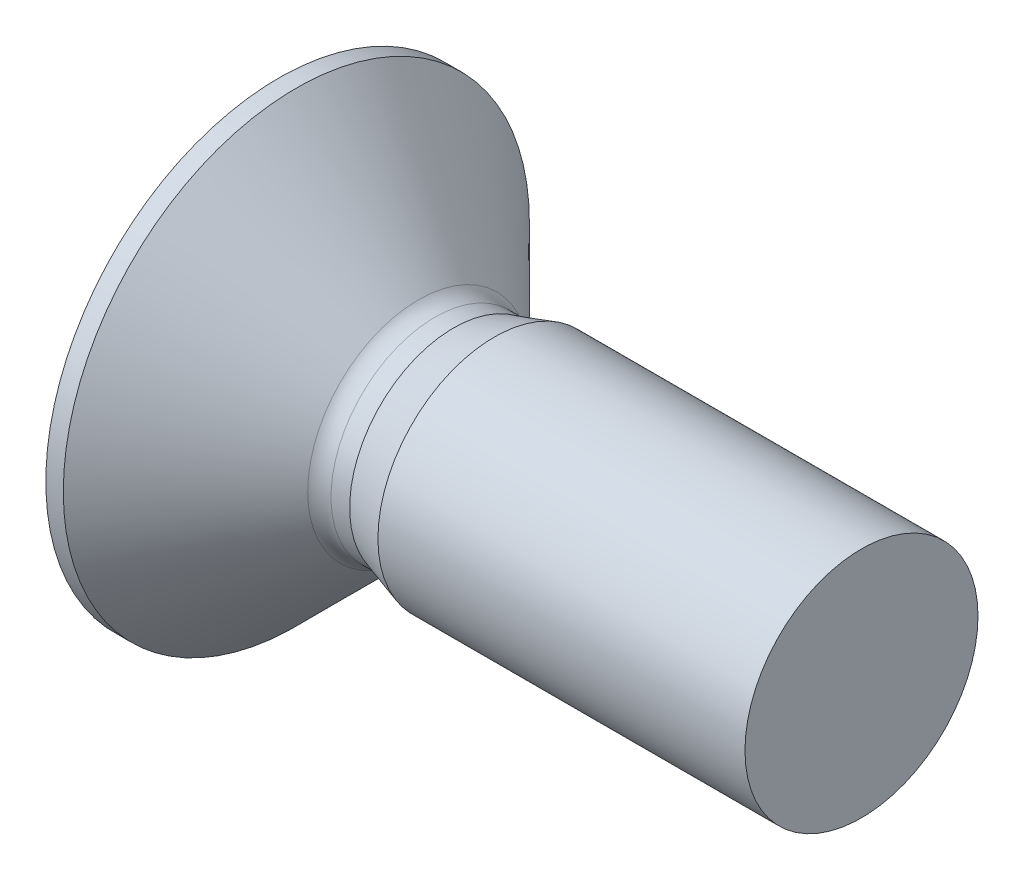
ISO-10303-21;
HEADER;
FILE_DESCRIPTION(('STEP AP214'),'2;1');
FILE_NAME('part.step','',(''),(''),'','','');
FILE_SCHEMA(('AUTOMOTIVE_DESIGN { 1 0 10303 214 1 1 1 1 }'));
ENDSEC;
DATA;
#1=APPLICATION_CONTEXT('core data for automotive mechanical design processes');
#2=APPLICATION_PROTOCOL_DEFINITION('international standard','automotive_design',2000,#1);
#3=PRODUCT_CONTEXT('',#1,'mechanical');
#4=PRODUCT('Part','Part','',(#3));
#5=PRODUCT_RELATED_PRODUCT_CATEGORY('part','',(#4));
#6=PRODUCT_DEFINITION_FORMATION('','',#4);
#7=PRODUCT_DEFINITION_CONTEXT('part definition',#1,'design');
#8=PRODUCT_DEFINITION('design','',#6,#7);
#9=PRODUCT_DEFINITION_SHAPE('','',#8);
#10=(LENGTH_UNIT() NAMED_UNIT(*) SI_UNIT(.MILLI.,.METRE.));
#11=(NAMED_UNIT(*) PLANE_ANGLE_UNIT() SI_UNIT($,.RADIAN.));
#12=(NAMED_UNIT(*) SI_UNIT($,.STERADIAN.) SOLID_ANGLE_UNIT());
#13=UNCERTAINTY_MEASURE_WITH_UNIT(LENGTH_MEASURE(1.E-05),#10,'distance_accuracy_value','');
#14=(GEOMETRIC_REPRESENTATION_CONTEXT(3) GLOBAL_UNCERTAINTY_ASSIGNED_CONTEXT((#13)) GLOBAL_UNIT_ASSIGNED_CONTEXT((#10,
#11,#12)) REPRESENTATION_CONTEXT('',''));
#15=CARTESIAN_POINT('',(0.,0.,0.));
#16=DIRECTION('',(0.,0.,1.));
#17=DIRECTION('',(1.,0.,0.));
#18=AXIS2_PLACEMENT_3D('',#15,#16,#17);
#19=CARTESIAN_POINT('',(-2.3,0.,0.));
#20=DIRECTION('',(1.,0.,0.));
#21=DIRECTION('',(0.,0.,-1.));
#22=AXIS2_PLACEMENT_3D('',#19,#20,#21);
#23=CYLINDRICAL_SURFACE('',#22,4.);
#24=CARTESIAN_POINT('',(-2.3,0.,0.));
#25=DIRECTION('',(1.,0.,0.));
#26=DIRECTION('',(0.,0.,-1.));
#27=AXIS2_PLACEMENT_3D('',#24,#25,#26);
#28=CIRCLE('',#27,4.);
#29=CARTESIAN_POINT('',(-2.3,0.,-4.));
#30=VERTEX_POINT('',#29);
#31=EDGE_CURVE('E299',#30,#30,#28,.T.);
#32=ORIENTED_EDGE('',*,*,#31,.T.);
#33=EDGE_LOOP('',(#32));
#34=FACE_BOUND('',#33,.T.);
#35=CARTESIAN_POINT('',(-2.,0.,0.));
#36=DIRECTION('',(1.,0.,0.));
#37=DIRECTION('',(0.,0.,-1.));
#38=AXIS2_PLACEMENT_3D('',#35,#36,#37);
#39=CIRCLE('',#38,4.);
#40=CARTESIAN_POINT('',(-2.,0.,-4.));
#41=VERTEX_POINT('',#40);
#42=EDGE_CURVE('E263',#41,#41,#39,.T.);
#43=ORIENTED_EDGE('',*,*,#42,.F.);
#44=EDGE_LOOP('',(#43));
#45=FACE_BOUND('',#44,.T.);
#46=ADVANCED_FACE('F43',(#34,#45),#23,.T.);
#47=CARTESIAN_POINT('',(-2.3,4.,0.));
#48=DIRECTION('',(-1.,0.,0.));
#49=DIRECTION('',(0.,0.,1.));
#50=AXIS2_PLACEMENT_3D('',#47,#48,#49);
#51=PLANE('',#50);
#52=DIRECTION('',(0.,1.,0.));
#53=VECTOR('',#52,1.);
#54=CARTESIAN_POINT('',(-2.3,0.53333333333333,0.53333333333333));
#55=LINE('',#54,#53);
#56=CARTESIAN_POINT('',(-2.3,1.33333333333334,0.53333333333333));
#57=VERTEX_POINT('',#56);
#58=CARTESIAN_POINT('',(-2.3,2.25,0.53333333333333));
#59=VERTEX_POINT('',#58);
#60=EDGE_CURVE('E232',#57,#59,#55,.T.);
#61=ORIENTED_EDGE('',*,*,#60,.F.);
#62=CARTESIAN_POINT('',(-2.3,1.33333333333334,1.33333333333334));
#63=DIRECTION('',(-1.,0.,0.));
#64=DIRECTION('',(0.,0.,1.));
#65=AXIS2_PLACEMENT_3D('',#62,#63,#64);
#66=CIRCLE('',#65,0.80000000000001);
#67=CARTESIAN_POINT('',(-2.3,0.53333333333333,1.33333333333334));
#68=VERTEX_POINT('',#67);
#69=EDGE_CURVE('E324',#57,#68,#66,.T.);
#70=ORIENTED_EDGE('',*,*,#69,.T.);
#71=DIRECTION('',(0.,0.,-1.));
#72=VECTOR('',#71,1.);
#73=CARTESIAN_POINT('',(-2.3,0.53333333333333,2.25));
#74=LINE('',#73,#72);
#75=CARTESIAN_POINT('',(-2.3,0.53333333333333,2.25));
#76=VERTEX_POINT('',#75);
#77=EDGE_CURVE('E228',#76,#68,#74,.T.);
#78=ORIENTED_EDGE('',*,*,#77,.F.);
#79=DIRECTION('',(0.,1.,0.));
#80=VECTOR('',#79,1.);
#81=CARTESIAN_POINT('',(-2.3,-0.53333333333333,2.25));
#82=LINE('',#81,#80);
#83=CARTESIAN_POINT('',(-2.3,-0.53333333333333,2.25));
#84=VERTEX_POINT('',#83);
#85=EDGE_CURVE('E225',#84,#76,#82,.T.);
#86=ORIENTED_EDGE('',*,*,#85,.F.);
#87=DIRECTION('',(0.,0.,1.));
#88=VECTOR('',#87,1.);
#89=CARTESIAN_POINT('',(-2.3,-0.53333333333333,0.53333333333333));
#90=LINE('',#89,#88);
#91=CARTESIAN_POINT('',(-2.3,-0.53333333333333,1.33333333333334));
#92=VERTEX_POINT('',#91);
#93=EDGE_CURVE('E175',#92,#84,#90,.T.);
#94=ORIENTED_EDGE('',*,*,#93,.F.);
#95=CARTESIAN_POINT('',(-2.3,-1.33333333333334,1.33333333333334));
#96=DIRECTION('',(-1.,0.,0.));
#97=DIRECTION('',(0.,0.,1.));
#98=AXIS2_PLACEMENT_3D('',#95,#96,#97);
#99=CIRCLE('',#98,0.80000000000001);
#100=CARTESIAN_POINT('',(-2.3,-1.33333333333334,0.53333333333333));
#101=VERTEX_POINT('',#100);
#102=EDGE_CURVE('E321',#92,#101,#99,.T.);
#103=ORIENTED_EDGE('',*,*,#102,.T.);
#104=DIRECTION('',(0.,1.,0.));
#105=VECTOR('',#104,1.);
#106=CARTESIAN_POINT('',(-2.3,-2.25,0.53333333333333));
#107=LINE('',#106,#105);
#108=CARTESIAN_POINT('',(-2.3,-2.25,0.53333333333333));
#109=VERTEX_POINT('',#108);
#110=EDGE_CURVE('E219',#109,#101,#107,.T.);
#111=ORIENTED_EDGE('',*,*,#110,.F.);
#112=DIRECTION('',(0.,0.,1.));
#113=VECTOR('',#112,1.);
#114=CARTESIAN_POINT('',(-2.3,-2.25,-0.53333333333333));
#115=LINE('',#114,#113);
#116=CARTESIAN_POINT('',(-2.3,-2.25,-0.53333333333333));
#117=VERTEX_POINT('',#116);
#118=EDGE_CURVE('E256',#117,#109,#115,.T.);
#119=ORIENTED_EDGE('',*,*,#118,.F.);
#120=DIRECTION('',(0.,-1.,0.));
#121=VECTOR('',#120,1.);
#122=CARTESIAN_POINT('',(-2.3,-0.53333333333333,-0.53333333333333));
#123=LINE('',#122,#121);
#124=CARTESIAN_POINT('',(-2.3,-1.33333333333334,-0.53333333333333));
#125=VERTEX_POINT('',#124);
#126=EDGE_CURVE('E253',#125,#117,#123,.T.);
#127=ORIENTED_EDGE('',*,*,#126,.F.);
#128=CARTESIAN_POINT('',(-2.3,-1.33333333333334,-1.33333333333334));
#129=DIRECTION('',(-1.,0.,0.));
#130=DIRECTION('',(0.,0.,1.));
#131=AXIS2_PLACEMENT_3D('',#128,#129,#130);
#132=CIRCLE('',#131,0.80000000000001);
#133=CARTESIAN_POINT('',(-2.3,-0.53333333333333,-1.33333333333334));
#134=VERTEX_POINT('',#133);
#135=EDGE_CURVE('E318',#125,#134,#132,.T.);
#136=ORIENTED_EDGE('',*,*,#135,.T.);
#137=DIRECTION('',(0.,0.,1.));
#138=VECTOR('',#137,1.);
#139=CARTESIAN_POINT('',(-2.3,-0.53333333333333,-2.25));
#140=LINE('',#139,#138);
#141=CARTESIAN_POINT('',(-2.3,-0.53333333333333,-2.25));
#142=VERTEX_POINT('',#141);
#143=EDGE_CURVE('E249',#142,#134,#140,.T.);
#144=ORIENTED_EDGE('',*,*,#143,.F.);
#145=DIRECTION('',(0.,-1.,0.));
#146=VECTOR('',#145,1.);
#147=CARTESIAN_POINT('',(-2.3,0.53333333333333,-2.25));
#148=LINE('',#147,#146);
#149=CARTESIAN_POINT('',(-2.3,0.53333333333333,-2.25));
#150=VERTEX_POINT('',#149);
#151=EDGE_CURVE('E245',#150,#142,#148,.T.);
#152=ORIENTED_EDGE('',*,*,#151,.F.);
#153=DIRECTION('',(0.,0.,-1.));
#154=VECTOR('',#153,1.);
#155=CARTESIAN_POINT('',(-2.3,0.53333333333333,-0.53333333333333));
#156=LINE('',#155,#154);
#157=CARTESIAN_POINT('',(-2.3,0.53333333333333,-1.33333333333334));
#158=VERTEX_POINT('',#157);
#159=EDGE_CURVE('E242',#158,#150,#156,.T.);
#160=ORIENTED_EDGE('',*,*,#159,.F.);
#161=CARTESIAN_POINT('',(-2.3,1.33333333333334,-1.33333333333334));
#162=DIRECTION('',(-1.,0.,0.));
#163=DIRECTION('',(0.,0.,1.));
#164=AXIS2_PLACEMENT_3D('',#161,#162,#163);
#165=CIRCLE('',#164,0.80000000000001);
#166=CARTESIAN_POINT('',(-2.3,1.33333333333334,-0.53333333333333));
#167=VERTEX_POINT('',#166);
#168=EDGE_CURVE('E315',#158,#167,#165,.T.);
#169=ORIENTED_EDGE('',*,*,#168,.T.);
#170=DIRECTION('',(0.,-1.,0.));
#171=VECTOR('',#170,1.);
#172=CARTESIAN_POINT('',(-2.3,2.25,-0.53333333333333));
#173=LINE('',#172,#171);
#174=CARTESIAN_POINT('',(-2.3,2.25,-0.53333333333333));
#175=VERTEX_POINT('',#174);
#176=EDGE_CURVE('E239',#175,#167,#173,.T.);
#177=ORIENTED_EDGE('',*,*,#176,.F.);
#178=DIRECTION('',(0.,0.,-1.));
#179=VECTOR('',#178,1.);
#180=CARTESIAN_POINT('',(-2.3,2.25,0.53333333333333));
#181=LINE('',#180,#179);
#182=EDGE_CURVE('E235',#59,#175,#181,.T.);
#183=ORIENTED_EDGE('',*,*,#182,.F.);
#184=EDGE_LOOP('',(#61,#70,#78,#86,#94,#103,#111,#119,#127,#136,#144,#152,#160,#169,#177,#183));
#185=FACE_BOUND('',#184,.T.);
#186=ORIENTED_EDGE('',*,*,#31,.F.);
#187=EDGE_LOOP('',(#186));
#188=FACE_BOUND('',#187,.T.);
#189=ADVANCED_FACE('F369',(#185,#188),#51,.T.);
#190=CARTESIAN_POINT('',(7.7,0.,0.));
#191=DIRECTION('',(1.,0.,0.));
#192=DIRECTION('',(0.,0.,-1.));
#193=AXIS2_PLACEMENT_3D('',#190,#191,#192);
#194=PLANE('',#193);
#195=CARTESIAN_POINT('',(7.7,0.,0.));
#196=DIRECTION('',(1.,0.,0.));
#197=DIRECTION('',(0.,0.,-1.));
#198=AXIS2_PLACEMENT_3D('',#195,#196,#197);
#199=CIRCLE('',#198,2.);
#200=CARTESIAN_POINT('',(7.7,0.,-2.));
#201=VERTEX_POINT('',#200);
#202=EDGE_CURVE('E295',#201,#201,#199,.T.);
#203=ORIENTED_EDGE('',*,*,#202,.T.);
#204=EDGE_LOOP('',(#203));
#205=FACE_BOUND('',#204,.T.);
#206=ADVANCED_FACE('F396',(#205),#194,.T.);
#207=CARTESIAN_POINT('',(-2.3,0.,0.));
#208=DIRECTION('',(1.,0.,0.));
#209=DIRECTION('',(0.,0.,-1.));
#210=AXIS2_PLACEMENT_3D('',#207,#208,#209);
#211=CYLINDRICAL_SURFACE('',#210,2.);
#212=CARTESIAN_POINT('',(1.4,0.,0.));
#213=DIRECTION('',(1.,0.,0.));
#214=DIRECTION('',(0.,0.,-1.));
#215=AXIS2_PLACEMENT_3D('',#212,#213,#214);
#216=CIRCLE('',#215,2.);
#217=CARTESIAN_POINT('',(1.4,0.,-2.));
#218=VERTEX_POINT('',#217);
#219=EDGE_CURVE('E291',#218,#218,#216,.T.);
#220=ORIENTED_EDGE('',*,*,#219,.T.);
#221=EDGE_LOOP('',(#220));
#222=FACE_BOUND('',#221,.T.);
#223=ORIENTED_EDGE('',*,*,#202,.F.);
#224=EDGE_LOOP('',(#223));
#225=FACE_BOUND('',#224,.T.);
#226=ADVANCED_FACE('F464',(#222,#225),#211,.T.);
#227=CARTESIAN_POINT('',(1.4,0.,0.));
#228=DIRECTION('',(1.,0.,0.));
#229=DIRECTION('',(0.,0.,-1.));
#230=AXIS2_PLACEMENT_3D('',#227,#228,#229);
#231=CONICAL_SURFACE('',#230,2.,0.297670535350329);
#232=CARTESIAN_POINT('',(0.7,0.,0.));
#233=DIRECTION('',(1.,0.,0.));
#234=DIRECTION('',(0.,0.,-1.));
#235=AXIS2_PLACEMENT_3D('',#232,#233,#234);
#236=CIRCLE('',#235,1.78525);
#237=CARTESIAN_POINT('',(0.7,0.,-1.78525));
#238=VERTEX_POINT('',#237);
#239=EDGE_CURVE('E287',#238,#238,#236,.T.);
#240=ORIENTED_EDGE('',*,*,#239,.T.);
#241=EDGE_LOOP('',(#240));
#242=FACE_BOUND('',#241,.T.);
#243=ORIENTED_EDGE('',*,*,#219,.F.);
#244=EDGE_LOOP('',(#243));
#245=FACE_BOUND('',#244,.T.);
#246=ADVANCED_FACE('F460',(#242,#245),#231,.T.);
#247=CARTESIAN_POINT('',(-2.3,0.,0.));
#248=DIRECTION('',(1.,0.,0.));
#249=DIRECTION('',(0.,0.,-1.));
#250=AXIS2_PLACEMENT_3D('',#247,#248,#249);
#251=CYLINDRICAL_SURFACE('',#250,1.78525);
#252=CARTESIAN_POINT('',(0.380435424949287,0.,0.));
#253=DIRECTION('',(1.,0.,0.));
#254=DIRECTION('',(0.,0.,-1.));
#255=AXIS2_PLACEMENT_3D('',#252,#253,#254);
#256=CIRCLE('',#255,1.78525);
#257=CARTESIAN_POINT('',(0.380435424949287,0.,-1.78525));
#258=VERTEX_POINT('',#257);
#259=EDGE_CURVE('E303',#258,#258,#256,.T.);
#260=ORIENTED_EDGE('',*,*,#259,.T.);
#261=EDGE_LOOP('',(#260));
#262=FACE_BOUND('',#261,.T.);
#263=ORIENTED_EDGE('',*,*,#239,.F.);
#264=EDGE_LOOP('',(#263));
#265=FACE_BOUND('',#264,.T.);
#266=ADVANCED_FACE('F456',(#262,#265),#251,.T.);
#267=CARTESIAN_POINT('',(0.214750000000022,0.,0.));
#268=DIRECTION('',(-1.,0.,0.));
#269=DIRECTION('',(0.,0.,1.));
#270=AXIS2_PLACEMENT_3D('',#267,#268,#269);
#271=CONICAL_SURFACE('',#270,1.78525,0.785398163397443);
#272=CARTESIAN_POINT('',(0.0975927124746219,0.,0.));
#273=DIRECTION('',(-1.,0.,0.));
#274=DIRECTION('',(0.,0.,1.));
#275=AXIS2_PLACEMENT_3D('',#272,#273,#274);
#276=CIRCLE('',#275,1.9024072875254);
#277=CARTESIAN_POINT('',(0.0975927124746219,0.,1.9024072875254));
#278=VERTEX_POINT('',#277);
#279=EDGE_CURVE('E307',#278,#278,#276,.T.);
#280=ORIENTED_EDGE('',*,*,#279,.T.);
#281=EDGE_LOOP('',(#280));
#282=FACE_BOUND('',#281,.T.);
#283=ORIENTED_EDGE('',*,*,#42,.T.);
#284=EDGE_LOOP('',(#283));
#285=FACE_BOUND('',#284,.T.);
#286=ADVANCED_FACE('F452',(#282,#285),#271,.T.);
#287=CARTESIAN_POINT('',(-1.15,-2.25,0.53333333333333));
#288=DIRECTION('',(0.,0.,1.));
#289=DIRECTION('',(1.,0.,0.));
#290=AXIS2_PLACEMENT_3D('',#287,#288,#289);
#291=PLANE('',#290);
#292=ORIENTED_EDGE('',*,*,#110,.T.);
#293=DIRECTION('',(-1.,0.,0.));
#294=VECTOR('',#293,1.);
#295=CARTESIAN_POINT('',(-1.15,-1.33333333333334,0.53333333333333));
#296=LINE('',#295,#294);
#297=CARTESIAN_POINT('',(-1.15,-1.33333333333334,0.53333333333333));
#298=VERTEX_POINT('',#297);
#299=EDGE_CURVE('E333',#101,#298,#296,.F.);
#300=ORIENTED_EDGE('',*,*,#299,.T.);
#301=DIRECTION('',(0.,1.,0.));
#302=VECTOR('',#301,1.);
#303=CARTESIAN_POINT('',(-1.15,-2.25,0.53333333333333));
#304=LINE('',#303,#302);
#305=CARTESIAN_POINT('',(-1.15,-2.25,0.53333333333333));
#306=VERTEX_POINT('',#305);
#307=EDGE_CURVE('E169',#306,#298,#304,.T.);
#308=ORIENTED_EDGE('',*,*,#307,.F.);
#309=DIRECTION('',(-1.,0.,0.));
#310=VECTOR('',#309,1.);
#311=CARTESIAN_POINT('',(-1.15,-2.25,0.53333333333333));
#312=LINE('',#311,#310);
#313=EDGE_CURVE('E260',#306,#109,#312,.T.);
#314=ORIENTED_EDGE('',*,*,#313,.T.);
#315=EDGE_LOOP('',(#292,#300,#308,#314));
#316=FACE_BOUND('',#315,.T.);
#317=ADVANCED_FACE('F448',(#316),#291,.F.);
#318=CARTESIAN_POINT('',(-1.15,-2.25,-0.53333333333333));
#319=DIRECTION('',(0.,-1.,0.));
#320=DIRECTION('',(0.,0.,-1.));
#321=AXIS2_PLACEMENT_3D('',#318,#319,#320);
#322=PLANE('',#321);
#323=ORIENTED_EDGE('',*,*,#118,.T.);
#324=ORIENTED_EDGE('',*,*,#313,.F.);
#325=DIRECTION('',(0.,0.,1.));
#326=VECTOR('',#325,1.);
#327=CARTESIAN_POINT('',(-1.15,-2.25,-0.53333333333333));
#328=LINE('',#327,#326);
#329=CARTESIAN_POINT('',(-1.15,-2.25,-0.53333333333333));
#330=VERTEX_POINT('',#329);
#331=EDGE_CURVE('E181',#330,#306,#328,.T.);
#332=ORIENTED_EDGE('',*,*,#331,.F.);
#333=DIRECTION('',(-1.,0.,0.));
#334=VECTOR('',#333,1.);
#335=CARTESIAN_POINT('',(-1.15,-2.25,-0.53333333333333));
#336=LINE('',#335,#334);
#337=EDGE_CURVE('E264',#330,#117,#336,.T.);
#338=ORIENTED_EDGE('',*,*,#337,.T.);
#339=EDGE_LOOP('',(#323,#324,#332,#338));
#340=FACE_BOUND('',#339,.T.);
#341=ADVANCED_FACE('F451',(#340),#322,.F.);
#342=CARTESIAN_POINT('',(-1.15,-0.53333333333333,-0.53333333333333));
#343=DIRECTION('',(0.,0.,-1.));
#344=DIRECTION('',(-1.,0.,0.));
#345=AXIS2_PLACEMENT_3D('',#342,#343,#344);
#346=PLANE('',#345);
#347=DIRECTION('',(0.,-1.,0.));
#348=VECTOR('',#347,1.);
#349=CARTESIAN_POINT('',(-1.15,-0.53333333333333,-0.53333333333333));
#350=LINE('',#349,#348);
#351=CARTESIAN_POINT('',(-1.15,-1.33333333333334,-0.53333333333333));
#352=VERTEX_POINT('',#351);
#353=EDGE_CURVE('E213',#352,#330,#350,.T.);
#354=ORIENTED_EDGE('',*,*,#353,.F.);
#355=DIRECTION('',(-1.,0.,0.));
#356=VECTOR('',#355,1.);
#357=CARTESIAN_POINT('',(-1.15,-1.33333333333334,-0.53333333333333));
#358=LINE('',#357,#356);
#359=EDGE_CURVE('E336',#352,#125,#358,.T.);
#360=ORIENTED_EDGE('',*,*,#359,.T.);
#361=ORIENTED_EDGE('',*,*,#126,.T.);
#362=ORIENTED_EDGE('',*,*,#337,.F.);
#363=EDGE_LOOP('',(#354,#360,#361,#362));
#364=FACE_BOUND('',#363,.T.);
#365=ADVANCED_FACE('F362',(#364),#346,.F.);
#366=CARTESIAN_POINT('',(-1.15,-0.53333333333333,-2.25));
#367=DIRECTION('',(0.,-1.,0.));
#368=DIRECTION('',(0.,0.,-1.));
#369=AXIS2_PLACEMENT_3D('',#366,#367,#368);
#370=PLANE('',#369);
#371=ORIENTED_EDGE('',*,*,#143,.T.);
#372=DIRECTION('',(-1.,0.,0.));
#373=VECTOR('',#372,1.);
#374=CARTESIAN_POINT('',(-1.15,-0.53333333333333,-1.33333333333334));
#375=LINE('',#374,#373);
#376=CARTESIAN_POINT('',(-1.15,-0.53333333333333,-1.33333333333334));
#377=VERTEX_POINT('',#376);
#378=EDGE_CURVE('E340',#134,#377,#375,.F.);
#379=ORIENTED_EDGE('',*,*,#378,.T.);
#380=DIRECTION('',(0.,0.,1.));
#381=VECTOR('',#380,1.);
#382=CARTESIAN_POINT('',(-1.15,-0.53333333333333,-2.25));
#383=LINE('',#382,#381);
#384=CARTESIAN_POINT('',(-1.15,-0.53333333333333,-2.25));
#385=VERTEX_POINT('',#384);
#386=EDGE_CURVE('E209',#385,#377,#383,.T.);
#387=ORIENTED_EDGE('',*,*,#386,.F.);
#388=DIRECTION('',(-1.,0.,0.));
#389=VECTOR('',#388,1.);
#390=CARTESIAN_POINT('',(-1.15,-0.53333333333333,-2.25));
#391=LINE('',#390,#389);
#392=EDGE_CURVE('E268',#385,#142,#391,.T.);
#393=ORIENTED_EDGE('',*,*,#392,.T.);
#394=EDGE_LOOP('',(#371,#379,#387,#393));
#395=FACE_BOUND('',#394,.T.);
#396=ADVANCED_FACE('F374',(#395),#370,.F.);
#397=CARTESIAN_POINT('',(-1.15,0.53333333333333,-2.25));
#398=DIRECTION('',(0.,0.,-1.));
#399=DIRECTION('',(-1.,0.,0.));
#400=AXIS2_PLACEMENT_3D('',#397,#398,#399);
#401=PLANE('',#400);
#402=ORIENTED_EDGE('',*,*,#151,.T.);
#403=ORIENTED_EDGE('',*,*,#392,.F.);
#404=DIRECTION('',(0.,-1.,0.));
#405=VECTOR('',#404,1.);
#406=CARTESIAN_POINT('',(-1.15,0.53333333333333,-2.25));
#407=LINE('',#406,#405);
#408=CARTESIAN_POINT('',(-1.15,0.53333333333333,-2.25));
#409=VERTEX_POINT('',#408);
#410=EDGE_CURVE('E205',#409,#385,#407,.T.);
#411=ORIENTED_EDGE('',*,*,#410,.F.);
#412=DIRECTION('',(-1.,0.,0.));
#413=VECTOR('',#412,1.);
#414=CARTESIAN_POINT('',(-1.15,0.53333333333333,-2.25));
#415=LINE('',#414,#413);
#416=EDGE_CURVE('E271',#409,#150,#415,.T.);
#417=ORIENTED_EDGE('',*,*,#416,.T.);
#418=EDGE_LOOP('',(#402,#403,#411,#417));
#419=FACE_BOUND('',#418,.T.);
#420=ADVANCED_FACE('F377',(#419),#401,.F.);
#421=CARTESIAN_POINT('',(-1.15,0.53333333333333,-0.53333333333333));
#422=DIRECTION('',(0.,1.,0.));
#423=DIRECTION('',(0.,0.,1.));
#424=AXIS2_PLACEMENT_3D('',#421,#422,#423);
#425=PLANE('',#424);
#426=DIRECTION('',(0.,0.,-1.));
#427=VECTOR('',#426,1.);
#428=CARTESIAN_POINT('',(-1.15,0.53333333333333,-0.53333333333333));
#429=LINE('',#428,#427);
#430=CARTESIAN_POINT('',(-1.15,0.53333333333333,-1.33333333333334));
#431=VERTEX_POINT('',#430);
#432=EDGE_CURVE('E202',#431,#409,#429,.T.);
#433=ORIENTED_EDGE('',*,*,#432,.F.);
#434=DIRECTION('',(-1.,0.,0.));
#435=VECTOR('',#434,1.);
#436=CARTESIAN_POINT('',(-1.15,0.53333333333333,-1.33333333333334));
#437=LINE('',#436,#435);
#438=EDGE_CURVE('E343',#431,#158,#437,.T.);
#439=ORIENTED_EDGE('',*,*,#438,.T.);
#440=ORIENTED_EDGE('',*,*,#159,.T.);
#441=ORIENTED_EDGE('',*,*,#416,.F.);
#442=EDGE_LOOP('',(#433,#439,#440,#441));
#443=FACE_BOUND('',#442,.T.);
#444=ADVANCED_FACE('F382',(#443),#425,.F.);
#445=CARTESIAN_POINT('',(-1.15,2.25,-0.53333333333333));
#446=DIRECTION('',(0.,0.,-1.));
#447=DIRECTION('',(-1.,0.,0.));
#448=AXIS2_PLACEMENT_3D('',#445,#446,#447);
#449=PLANE('',#448);
#450=ORIENTED_EDGE('',*,*,#176,.T.);
#451=DIRECTION('',(-1.,0.,0.));
#452=VECTOR('',#451,1.);
#453=CARTESIAN_POINT('',(-1.15,1.33333333333334,-0.53333333333333));
#454=LINE('',#453,#452);
#455=CARTESIAN_POINT('',(-1.15,1.33333333333334,-0.53333333333333));
#456=VERTEX_POINT('',#455);
#457=EDGE_CURVE('E59',#167,#456,#454,.F.);
#458=ORIENTED_EDGE('',*,*,#457,.T.);
#459=DIRECTION('',(0.,-1.,0.));
#460=VECTOR('',#459,1.);
#461=CARTESIAN_POINT('',(-1.15,2.25,-0.53333333333333));
#462=LINE('',#461,#460);
#463=CARTESIAN_POINT('',(-1.15,2.25,-0.53333333333333));
#464=VERTEX_POINT('',#463);
#465=EDGE_CURVE('E199',#464,#456,#462,.T.);
#466=ORIENTED_EDGE('',*,*,#465,.F.);
#467=DIRECTION('',(-1.,0.,0.));
#468=VECTOR('',#467,1.);
#469=CARTESIAN_POINT('',(-1.15,2.25,-0.53333333333333));
#470=LINE('',#469,#468);
#471=EDGE_CURVE('E275',#464,#175,#470,.T.);
#472=ORIENTED_EDGE('',*,*,#471,.T.);
#473=EDGE_LOOP('',(#450,#458,#466,#472));
#474=FACE_BOUND('',#473,.T.);
#475=ADVANCED_FACE('F429',(#474),#449,.F.);
#476=CARTESIAN_POINT('',(-1.15,2.25,0.53333333333333));
#477=DIRECTION('',(0.,1.,0.));
#478=DIRECTION('',(0.,0.,1.));
#479=AXIS2_PLACEMENT_3D('',#476,#477,#478);
#480=PLANE('',#479);
#481=ORIENTED_EDGE('',*,*,#182,.T.);
#482=ORIENTED_EDGE('',*,*,#471,.F.);
#483=DIRECTION('',(0.,0.,-1.));
#484=VECTOR('',#483,1.);
#485=CARTESIAN_POINT('',(-1.15,2.25,0.53333333333333));
#486=LINE('',#485,#484);
#487=CARTESIAN_POINT('',(-1.15,2.25,0.53333333333333));
#488=VERTEX_POINT('',#487);
#489=EDGE_CURVE('E195',#488,#464,#486,.T.);
#490=ORIENTED_EDGE('',*,*,#489,.F.);
#491=DIRECTION('',(-1.,0.,0.));
#492=VECTOR('',#491,1.);
#493=CARTESIAN_POINT('',(-1.15,2.25,0.53333333333333));
#494=LINE('',#493,#492);
#495=EDGE_CURVE('E278',#488,#59,#494,.T.);
#496=ORIENTED_EDGE('',*,*,#495,.T.);
#497=EDGE_LOOP('',(#481,#482,#490,#496));
#498=FACE_BOUND('',#497,.T.);
#499=ADVANCED_FACE('F428',(#498),#480,.F.);
#500=CARTESIAN_POINT('',(-1.15,0.53333333333333,0.53333333333333));
#501=DIRECTION('',(0.,0.,1.));
#502=DIRECTION('',(1.,0.,0.));
#503=AXIS2_PLACEMENT_3D('',#500,#501,#502);
#504=PLANE('',#503);
#505=DIRECTION('',(0.,1.,0.));
#506=VECTOR('',#505,1.);
#507=CARTESIAN_POINT('',(-1.15,0.53333333333333,0.53333333333333));
#508=LINE('',#507,#506);
#509=CARTESIAN_POINT('',(-1.15,1.33333333333334,0.53333333333333));
#510=VERTEX_POINT('',#509);
#511=EDGE_CURVE('E189',#510,#488,#508,.T.);
#512=ORIENTED_EDGE('',*,*,#511,.F.);
#513=DIRECTION('',(-1.,0.,0.));
#514=VECTOR('',#513,1.);
#515=CARTESIAN_POINT('',(-1.15,1.33333333333334,0.53333333333333));
#516=LINE('',#515,#514);
#517=EDGE_CURVE('E311',#510,#57,#516,.T.);
#518=ORIENTED_EDGE('',*,*,#517,.T.);
#519=ORIENTED_EDGE('',*,*,#60,.T.);
#520=ORIENTED_EDGE('',*,*,#495,.F.);
#521=EDGE_LOOP('',(#512,#518,#519,#520));
#522=FACE_BOUND('',#521,.T.);
#523=ADVANCED_FACE('F424',(#522),#504,.F.);
#524=CARTESIAN_POINT('',(-1.15,0.53333333333333,2.25));
#525=DIRECTION('',(0.,1.,0.));
#526=DIRECTION('',(0.,0.,1.));
#527=AXIS2_PLACEMENT_3D('',#524,#525,#526);
#528=PLANE('',#527);
#529=ORIENTED_EDGE('',*,*,#77,.T.);
#530=DIRECTION('',(-1.,0.,0.));
#531=VECTOR('',#530,1.);
#532=CARTESIAN_POINT('',(-1.15,0.53333333333333,1.33333333333334));
#533=LINE('',#532,#531);
#534=CARTESIAN_POINT('',(-1.15,0.53333333333333,1.33333333333334));
#535=VERTEX_POINT('',#534);
#536=EDGE_CURVE('E327',#68,#535,#533,.F.);
#537=ORIENTED_EDGE('',*,*,#536,.T.);
#538=DIRECTION('',(0.,0.,-1.));
#539=VECTOR('',#538,1.);
#540=CARTESIAN_POINT('',(-1.15,0.53333333333333,2.25));
#541=LINE('',#540,#539);
#542=CARTESIAN_POINT('',(-1.15,0.53333333333333,2.25));
#543=VERTEX_POINT('',#542);
#544=EDGE_CURVE('E186',#543,#535,#541,.T.);
#545=ORIENTED_EDGE('',*,*,#544,.F.);
#546=DIRECTION('',(-1.,0.,0.));
#547=VECTOR('',#546,1.);
#548=CARTESIAN_POINT('',(-1.15,0.53333333333333,2.25));
#549=LINE('',#548,#547);
#550=EDGE_CURVE('E180',#543,#76,#549,.T.);
#551=ORIENTED_EDGE('',*,*,#550,.T.);
#552=EDGE_LOOP('',(#529,#537,#545,#551));
#553=FACE_BOUND('',#552,.T.);
#554=ADVANCED_FACE('F418',(#553),#528,.F.);
#555=CARTESIAN_POINT('',(-1.15,-0.53333333333333,2.25));
#556=DIRECTION('',(0.,0.,1.));
#557=DIRECTION('',(1.,0.,0.));
#558=AXIS2_PLACEMENT_3D('',#555,#556,#557);
#559=PLANE('',#558);
#560=ORIENTED_EDGE('',*,*,#85,.T.);
#561=ORIENTED_EDGE('',*,*,#550,.F.);
#562=DIRECTION('',(0.,1.,0.));
#563=VECTOR('',#562,1.);
#564=CARTESIAN_POINT('',(-1.15,-0.53333333333333,2.25));
#565=LINE('',#564,#563);
#566=CARTESIAN_POINT('',(-1.15,-0.53333333333333,2.25));
#567=VERTEX_POINT('',#566);
#568=EDGE_CURVE('E162',#567,#543,#565,.T.);
#569=ORIENTED_EDGE('',*,*,#568,.F.);
#570=DIRECTION('',(-1.,0.,0.));
#571=VECTOR('',#570,1.);
#572=CARTESIAN_POINT('',(-1.15,-0.53333333333333,2.25));
#573=LINE('',#572,#571);
#574=EDGE_CURVE('E172',#567,#84,#573,.T.);
#575=ORIENTED_EDGE('',*,*,#574,.T.);
#576=EDGE_LOOP('',(#560,#561,#569,#575));
#577=FACE_BOUND('',#576,.T.);
#578=ADVANCED_FACE('F183',(#577),#559,.F.);
#579=CARTESIAN_POINT('',(-1.15,-0.53333333333333,0.53333333333333));
#580=DIRECTION('',(0.,-1.,0.));
#581=DIRECTION('',(0.,0.,-1.));
#582=AXIS2_PLACEMENT_3D('',#579,#580,#581);
#583=PLANE('',#582);
#584=DIRECTION('',(0.,0.,1.));
#585=VECTOR('',#584,1.);
#586=CARTESIAN_POINT('',(-1.15,-0.53333333333333,0.53333333333333));
#587=LINE('',#586,#585);
#588=CARTESIAN_POINT('',(-1.15,-0.53333333333333,1.33333333333334));
#589=VERTEX_POINT('',#588);
#590=EDGE_CURVE('E156',#589,#567,#587,.T.);
#591=ORIENTED_EDGE('',*,*,#590,.F.);
#592=DIRECTION('',(-1.,0.,0.));
#593=VECTOR('',#592,1.);
#594=CARTESIAN_POINT('',(-1.15,-0.53333333333333,1.33333333333334));
#595=LINE('',#594,#593);
#596=EDGE_CURVE('E330',#589,#92,#595,.T.);
#597=ORIENTED_EDGE('',*,*,#596,.T.);
#598=ORIENTED_EDGE('',*,*,#93,.T.);
#599=ORIENTED_EDGE('',*,*,#574,.F.);
#600=EDGE_LOOP('',(#591,#597,#598,#599));
#601=FACE_BOUND('',#600,.T.);
#602=ADVANCED_FACE('F173',(#601),#583,.F.);
#603=CARTESIAN_POINT('',(-1.15,0.,0.));
#604=DIRECTION('',(1.,0.,0.));
#605=DIRECTION('',(0.,0.,-1.));
#606=AXIS2_PLACEMENT_3D('',#603,#604,#605);
#607=PLANE('',#606);
#608=ORIENTED_EDGE('',*,*,#307,.T.);
#609=CARTESIAN_POINT('',(-1.15,-1.33333333333334,1.33333333333334));
#610=DIRECTION('',(1.,0.,0.));
#611=DIRECTION('',(0.,0.,-1.));
#612=AXIS2_PLACEMENT_3D('',#609,#610,#611);
#613=CIRCLE('',#612,0.80000000000001);
#614=EDGE_CURVE('E164',#298,#589,#613,.T.);
#615=ORIENTED_EDGE('',*,*,#614,.T.);
#616=ORIENTED_EDGE('',*,*,#590,.T.);
#617=ORIENTED_EDGE('',*,*,#568,.T.);
#618=ORIENTED_EDGE('',*,*,#544,.T.);
#619=CARTESIAN_POINT('',(-1.15,1.33333333333334,1.33333333333334));
#620=DIRECTION('',(1.,0.,0.));
#621=DIRECTION('',(0.,0.,-1.));
#622=AXIS2_PLACEMENT_3D('',#619,#620,#621);
#623=CIRCLE('',#622,0.80000000000001);
#624=EDGE_CURVE('E349',#535,#510,#623,.T.);
#625=ORIENTED_EDGE('',*,*,#624,.T.);
#626=ORIENTED_EDGE('',*,*,#511,.T.);
#627=ORIENTED_EDGE('',*,*,#489,.T.);
#628=ORIENTED_EDGE('',*,*,#465,.T.);
#629=CARTESIAN_POINT('',(-1.15,1.33333333333334,-1.33333333333334));
#630=DIRECTION('',(1.,0.,0.));
#631=DIRECTION('',(0.,0.,-1.));
#632=AXIS2_PLACEMENT_3D('',#629,#630,#631);
#633=CIRCLE('',#632,0.80000000000001);
#634=EDGE_CURVE('E11',#456,#431,#633,.T.);
#635=ORIENTED_EDGE('',*,*,#634,.T.);
#636=ORIENTED_EDGE('',*,*,#432,.T.);
#637=ORIENTED_EDGE('',*,*,#410,.T.);
#638=ORIENTED_EDGE('',*,*,#386,.T.);
#639=CARTESIAN_POINT('',(-1.15,-1.33333333333334,-1.33333333333334));
#640=DIRECTION('',(1.,0.,0.));
#641=DIRECTION('',(0.,0.,-1.));
#642=AXIS2_PLACEMENT_3D('',#639,#640,#641);
#643=CIRCLE('',#642,0.80000000000001);
#644=EDGE_CURVE('E52',#377,#352,#643,.T.);
#645=ORIENTED_EDGE('',*,*,#644,.T.);
#646=ORIENTED_EDGE('',*,*,#353,.T.);
#647=ORIENTED_EDGE('',*,*,#331,.T.);
#648=EDGE_LOOP('',(#608,#615,#616,#617,#618,#625,#626,#627,#628,#635,#636,#637,#638,#645,#646,#647));
#649=FACE_BOUND('',#648,.T.);
#650=ADVANCED_FACE('F159',(#649),#607,.F.);
#651=CARTESIAN_POINT('',(0.380435424949287,0.,0.));
#652=DIRECTION('',(1.,0.,0.));
#653=DIRECTION('',(0.,0.,-1.));
#654=AXIS2_PLACEMENT_3D('',#651,#652,#653);
#655=TOROIDAL_SURFACE('',#654,2.18525000000007,0.400000000000067);
#656=ORIENTED_EDGE('',*,*,#279,.F.);
#657=EDGE_LOOP('',(#656));
#658=FACE_BOUND('',#657,.T.);
#659=ORIENTED_EDGE('',*,*,#259,.F.);
#660=EDGE_LOOP('',(#659));
#661=FACE_BOUND('',#660,.T.);
#662=ADVANCED_FACE('F401',(#658,#661),#655,.F.);
#663=CARTESIAN_POINT('',(-1.15,1.33333333333334,1.33333333333334));
#664=DIRECTION('',(-1.,0.,0.));
#665=DIRECTION('',(0.,0.,1.));
#666=AXIS2_PLACEMENT_3D('',#663,#664,#665);
#667=CYLINDRICAL_SURFACE('',#666,0.80000000000001);
#668=ORIENTED_EDGE('',*,*,#624,.F.);
#669=ORIENTED_EDGE('',*,*,#536,.F.);
#670=ORIENTED_EDGE('',*,*,#69,.F.);
#671=ORIENTED_EDGE('',*,*,#517,.F.);
#672=EDGE_LOOP('',(#668,#669,#670,#671));
#673=FACE_BOUND('',#672,.T.);
#674=ADVANCED_FACE('F404',(#673),#667,.T.);
#675=CARTESIAN_POINT('',(-1.15,-1.33333333333334,1.33333333333334));
#676=DIRECTION('',(-1.,0.,0.));
#677=DIRECTION('',(0.,0.,1.));
#678=AXIS2_PLACEMENT_3D('',#675,#676,#677);
#679=CYLINDRICAL_SURFACE('',#678,0.80000000000001);
#680=ORIENTED_EDGE('',*,*,#614,.F.);
#681=ORIENTED_EDGE('',*,*,#299,.F.);
#682=ORIENTED_EDGE('',*,*,#102,.F.);
#683=ORIENTED_EDGE('',*,*,#596,.F.);
#684=EDGE_LOOP('',(#680,#681,#682,#683));
#685=FACE_BOUND('',#684,.T.);
#686=ADVANCED_FACE('F389',(#685),#679,.T.);
#687=CARTESIAN_POINT('',(-1.15,-1.33333333333334,-1.33333333333334));
#688=DIRECTION('',(-1.,0.,0.));
#689=DIRECTION('',(0.,0.,1.));
#690=AXIS2_PLACEMENT_3D('',#687,#688,#689);
#691=CYLINDRICAL_SURFACE('',#690,0.80000000000001);
#692=ORIENTED_EDGE('',*,*,#644,.F.);
#693=ORIENTED_EDGE('',*,*,#378,.F.);
#694=ORIENTED_EDGE('',*,*,#135,.F.);
#695=ORIENTED_EDGE('',*,*,#359,.F.);
#696=EDGE_LOOP('',(#692,#693,#694,#695));
#697=FACE_BOUND('',#696,.T.);
#698=ADVANCED_FACE('F365',(#697),#691,.T.);
#699=CARTESIAN_POINT('',(-1.15,1.33333333333334,-1.33333333333334));
#700=DIRECTION('',(-1.,0.,0.));
#701=DIRECTION('',(0.,0.,1.));
#702=AXIS2_PLACEMENT_3D('',#699,#700,#701);
#703=CYLINDRICAL_SURFACE('',#702,0.80000000000001);
#704=ORIENTED_EDGE('',*,*,#634,.F.);
#705=ORIENTED_EDGE('',*,*,#457,.F.);
#706=ORIENTED_EDGE('',*,*,#168,.F.);
#707=ORIENTED_EDGE('',*,*,#438,.F.);
#708=EDGE_LOOP('',(#704,#705,#706,#707));
#709=FACE_BOUND('',#708,.T.);
#710=ADVANCED_FACE('F45',(#709),#703,.T.);
#711=CLOSED_SHELL('',(#46,#189,#206,#226,#246,#266,#286,#317,#341,#365,#396,#420,#444,#475,#499,
#523,#554,#578,#602,#650,#662,#674,#686,#698,#710));
#712=MANIFOLD_SOLID_BREP('B2',#711);
#713=ADVANCED_BREP_SHAPE_REPRESENTATION('',(#18,#712),#14);
#714=SHAPE_DEFINITION_REPRESENTATION(#9,#713);
ENDSEC;
END-ISO-10303-21;
